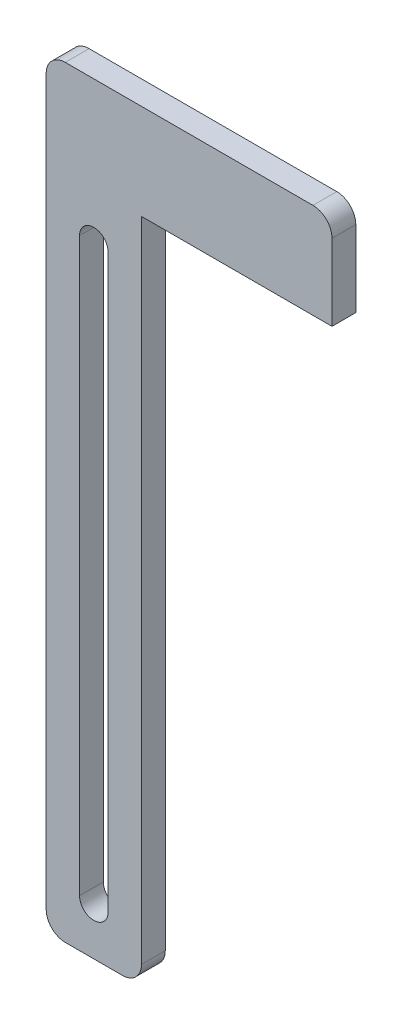
ISO-10303-21;
HEADER;
FILE_DESCRIPTION(('STEP AP214'),'2;1');
FILE_NAME('part.step','',(''),(''),'','','');
FILE_SCHEMA(('AUTOMOTIVE_DESIGN { 1 0 10303 214 1 1 1 1 }'));
ENDSEC;
DATA;
#1=APPLICATION_CONTEXT('core data for automotive mechanical design processes');
#2=APPLICATION_PROTOCOL_DEFINITION('international standard','automotive_design',2000,#1);
#3=PRODUCT_CONTEXT('',#1,'mechanical');
#4=PRODUCT('Part','Part','',(#3));
#5=PRODUCT_RELATED_PRODUCT_CATEGORY('part','',(#4));
#6=PRODUCT_DEFINITION_FORMATION('','',#4);
#7=PRODUCT_DEFINITION_CONTEXT('part definition',#1,'design');
#8=PRODUCT_DEFINITION('design','',#6,#7);
#9=PRODUCT_DEFINITION_SHAPE('','',#8);
#10=(LENGTH_UNIT() NAMED_UNIT(*) SI_UNIT(.MILLI.,.METRE.));
#11=(NAMED_UNIT(*) PLANE_ANGLE_UNIT() SI_UNIT($,.RADIAN.));
#12=(NAMED_UNIT(*) SI_UNIT($,.STERADIAN.) SOLID_ANGLE_UNIT());
#13=UNCERTAINTY_MEASURE_WITH_UNIT(LENGTH_MEASURE(1.E-05),#10,'distance_accuracy_value','');
#14=(GEOMETRIC_REPRESENTATION_CONTEXT(3) GLOBAL_UNCERTAINTY_ASSIGNED_CONTEXT((#13)) GLOBAL_UNIT_ASSIGNED_CONTEXT((#10,
#11,#12)) REPRESENTATION_CONTEXT('',''));
#15=CARTESIAN_POINT('',(0.,0.,0.));
#16=DIRECTION('',(0.,0.,1.));
#17=DIRECTION('',(1.,0.,0.));
#18=AXIS2_PLACEMENT_3D('',#15,#16,#17);
#19=CARTESIAN_POINT('',(0.,0.,3.175));
#20=DIRECTION('',(0.,0.,1.));
#21=DIRECTION('',(1.,0.,0.));
#22=AXIS2_PLACEMENT_3D('',#19,#20,#21);
#23=PLANE('',#22);
#24=DIRECTION('',(1.,0.,0.));
#25=VECTOR('',#24,1.);
#26=CARTESIAN_POINT('',(0.,0.,3.175));
#27=LINE('',#26,#25);
#28=CARTESIAN_POINT('',(2.54,0.,3.175));
#29=VERTEX_POINT('',#28);
#30=CARTESIAN_POINT('',(10.16,0.,3.175));
#31=VERTEX_POINT('',#30);
#32=EDGE_CURVE('E238',#29,#31,#27,.T.);
#33=ORIENTED_EDGE('',*,*,#32,.T.);
#34=CARTESIAN_POINT('',(10.16,2.54,3.175));
#35=DIRECTION('',(0.,0.,1.));
#36=DIRECTION('',(1.,0.,0.));
#37=AXIS2_PLACEMENT_3D('',#34,#35,#36);
#38=CIRCLE('',#37,2.54);
#39=CARTESIAN_POINT('',(12.7,2.54,3.175));
#40=VERTEX_POINT('',#39);
#41=EDGE_CURVE('E193',#31,#40,#38,.T.);
#42=ORIENTED_EDGE('',*,*,#41,.T.);
#43=DIRECTION('',(0.,1.,0.));
#44=VECTOR('',#43,1.);
#45=CARTESIAN_POINT('',(12.7,0.,3.175));
#46=LINE('',#45,#44);
#47=CARTESIAN_POINT('',(12.7,88.9,3.175));
#48=VERTEX_POINT('',#47);
#49=EDGE_CURVE('E184',#40,#48,#46,.T.);
#50=ORIENTED_EDGE('',*,*,#49,.T.);
#51=DIRECTION('',(1.,0.,0.));
#52=VECTOR('',#51,1.);
#53=CARTESIAN_POINT('',(0.,88.9,3.175));
#54=LINE('',#53,#52);
#55=CARTESIAN_POINT('',(38.1,88.9,3.175));
#56=VERTEX_POINT('',#55);
#57=EDGE_CURVE('E190',#48,#56,#54,.T.);
#58=ORIENTED_EDGE('',*,*,#57,.T.);
#59=DIRECTION('',(0.,-1.,0.));
#60=VECTOR('',#59,1.);
#61=CARTESIAN_POINT('',(38.1,0.,3.175));
#62=LINE('',#61,#60);
#63=CARTESIAN_POINT('',(38.1,99.06,3.175));
#64=VERTEX_POINT('',#63);
#65=EDGE_CURVE('E217',#64,#56,#62,.T.);
#66=ORIENTED_EDGE('',*,*,#65,.F.);
#67=CARTESIAN_POINT('',(35.56,99.06,3.175));
#68=DIRECTION('',(0.,0.,1.));
#69=DIRECTION('',(1.,0.,0.));
#70=AXIS2_PLACEMENT_3D('',#67,#68,#69);
#71=CIRCLE('',#70,2.54);
#72=CARTESIAN_POINT('',(35.56,101.6,3.175));
#73=VERTEX_POINT('',#72);
#74=EDGE_CURVE('E259',#64,#73,#71,.T.);
#75=ORIENTED_EDGE('',*,*,#74,.T.);
#76=DIRECTION('',(1.,0.,0.));
#77=VECTOR('',#76,1.);
#78=CARTESIAN_POINT('',(0.,101.6,3.175));
#79=LINE('',#78,#77);
#80=CARTESIAN_POINT('',(2.53999999999998,101.6,3.175));
#81=VERTEX_POINT('',#80);
#82=EDGE_CURVE('E213',#81,#73,#79,.T.);
#83=ORIENTED_EDGE('',*,*,#82,.F.);
#84=CARTESIAN_POINT('',(2.53999999999998,99.06,3.175));
#85=DIRECTION('',(0.,0.,1.));
#86=DIRECTION('',(1.,0.,0.));
#87=AXIS2_PLACEMENT_3D('',#84,#85,#86);
#88=CIRCLE('',#87,2.54);
#89=CARTESIAN_POINT('',(0.,99.06,3.175));
#90=VERTEX_POINT('',#89);
#91=EDGE_CURVE('E98',#81,#90,#88,.T.);
#92=ORIENTED_EDGE('',*,*,#91,.T.);
#93=DIRECTION('',(0.,1.,0.));
#94=VECTOR('',#93,1.);
#95=CARTESIAN_POINT('',(0.,0.,3.175));
#96=LINE('',#95,#94);
#97=CARTESIAN_POINT('',(0.,2.54,3.175));
#98=VERTEX_POINT('',#97);
#99=EDGE_CURVE('E197',#98,#90,#96,.T.);
#100=ORIENTED_EDGE('',*,*,#99,.F.);
#101=CARTESIAN_POINT('',(2.54,2.54,3.175));
#102=DIRECTION('',(0.,0.,1.));
#103=DIRECTION('',(1.,0.,0.));
#104=AXIS2_PLACEMENT_3D('',#101,#102,#103);
#105=CIRCLE('',#104,2.54);
#106=EDGE_CURVE('E265',#98,#29,#105,.T.);
#107=ORIENTED_EDGE('',*,*,#106,.T.);
#108=EDGE_LOOP('',(#33,#42,#50,#58,#66,#75,#83,#92,#100,#107));
#109=FACE_BOUND('',#108,.T.);
#110=DIRECTION('',(0.,-1.,0.));
#111=VECTOR('',#110,1.);
#112=CARTESIAN_POINT('',(4.445,0.,3.175));
#113=LINE('',#112,#111);
#114=CARTESIAN_POINT('',(4.44499999999999,82.55,3.175));
#115=VERTEX_POINT('',#114);
#116=CARTESIAN_POINT('',(4.445,6.35,3.175));
#117=VERTEX_POINT('',#116);
#118=EDGE_CURVE('E291',#115,#117,#113,.T.);
#119=ORIENTED_EDGE('',*,*,#118,.F.);
#120=CARTESIAN_POINT('',(6.34999999999999,82.55,3.175));
#121=DIRECTION('',(0.,0.,1.));
#122=DIRECTION('',(1.,0.,0.));
#123=AXIS2_PLACEMENT_3D('',#120,#121,#122);
#124=CIRCLE('',#123,1.905);
#125=CARTESIAN_POINT('',(8.25499999999999,82.55,3.175));
#126=VERTEX_POINT('',#125);
#127=EDGE_CURVE('E299',#126,#115,#124,.T.);
#128=ORIENTED_EDGE('',*,*,#127,.F.);
#129=DIRECTION('',(0.,-1.,0.));
#130=VECTOR('',#129,1.);
#131=CARTESIAN_POINT('',(8.255,0.,3.175));
#132=LINE('',#131,#130);
#133=CARTESIAN_POINT('',(8.255,6.35,3.175));
#134=VERTEX_POINT('',#133);
#135=EDGE_CURVE('E296',#126,#134,#132,.T.);
#136=ORIENTED_EDGE('',*,*,#135,.T.);
#137=CARTESIAN_POINT('',(6.35,6.35,3.175));
#138=DIRECTION('',(0.,0.,1.));
#139=DIRECTION('',(1.,0.,0.));
#140=AXIS2_PLACEMENT_3D('',#137,#138,#139);
#141=CIRCLE('',#140,1.905);
#142=EDGE_CURVE('E293',#117,#134,#141,.T.);
#143=ORIENTED_EDGE('',*,*,#142,.F.);
#144=EDGE_LOOP('',(#119,#128,#136,#143));
#145=FACE_BOUND('',#144,.T.);
#146=ADVANCED_FACE('F83',(#109,#145),#23,.T.);
#147=CARTESIAN_POINT('',(38.1,0.,3.175));
#148=DIRECTION('',(1.,0.,0.));
#149=DIRECTION('',(0.,1.,0.));
#150=AXIS2_PLACEMENT_3D('',#147,#148,#149);
#151=PLANE('',#150);
#152=DIRECTION('',(0.,-1.,0.));
#153=VECTOR('',#152,1.);
#154=CARTESIAN_POINT('',(38.1,0.,0.));
#155=LINE('',#154,#153);
#156=CARTESIAN_POINT('',(38.1,99.06,0.));
#157=VERTEX_POINT('',#156);
#158=CARTESIAN_POINT('',(38.1,88.9,0.));
#159=VERTEX_POINT('',#158);
#160=EDGE_CURVE('E239',#157,#159,#155,.T.);
#161=ORIENTED_EDGE('',*,*,#160,.F.);
#162=DIRECTION('',(0.,0.,-1.));
#163=VECTOR('',#162,1.);
#164=CARTESIAN_POINT('',(38.1,99.06,3.175));
#165=LINE('',#164,#163);
#166=EDGE_CURVE('E12',#157,#64,#165,.F.);
#167=ORIENTED_EDGE('',*,*,#166,.T.);
#168=ORIENTED_EDGE('',*,*,#65,.T.);
#169=DIRECTION('',(0.,0.,-1.));
#170=VECTOR('',#169,1.);
#171=CARTESIAN_POINT('',(38.1,88.9,3.175));
#172=LINE('',#171,#170);
#173=EDGE_CURVE('E209',#56,#159,#172,.T.);
#174=ORIENTED_EDGE('',*,*,#173,.T.);
#175=EDGE_LOOP('',(#161,#167,#168,#174));
#176=FACE_BOUND('',#175,.T.);
#177=ADVANCED_FACE('F344',(#176),#151,.T.);
#178=CARTESIAN_POINT('',(0.,0.,0.));
#179=DIRECTION('',(0.,0.,1.));
#180=DIRECTION('',(1.,0.,0.));
#181=AXIS2_PLACEMENT_3D('',#178,#179,#180);
#182=PLANE('',#181);
#183=DIRECTION('',(0.,1.,0.));
#184=VECTOR('',#183,1.);
#185=CARTESIAN_POINT('',(12.7,0.,0.));
#186=LINE('',#185,#184);
#187=CARTESIAN_POINT('',(12.7,2.54,0.));
#188=VERTEX_POINT('',#187);
#189=CARTESIAN_POINT('',(12.7,88.9,0.));
#190=VERTEX_POINT('',#189);
#191=EDGE_CURVE('E204',#188,#190,#186,.T.);
#192=ORIENTED_EDGE('',*,*,#191,.F.);
#193=CARTESIAN_POINT('',(10.16,2.54,0.));
#194=DIRECTION('',(0.,0.,1.));
#195=DIRECTION('',(1.,0.,0.));
#196=AXIS2_PLACEMENT_3D('',#193,#194,#195);
#197=CIRCLE('',#196,2.54);
#198=CARTESIAN_POINT('',(10.16,0.,0.));
#199=VERTEX_POINT('',#198);
#200=EDGE_CURVE('E257',#188,#199,#197,.F.);
#201=ORIENTED_EDGE('',*,*,#200,.T.);
#202=DIRECTION('',(1.,0.,0.));
#203=VECTOR('',#202,1.);
#204=CARTESIAN_POINT('',(0.,0.,0.));
#205=LINE('',#204,#203);
#206=CARTESIAN_POINT('',(2.54,0.,0.));
#207=VERTEX_POINT('',#206);
#208=EDGE_CURVE('E198',#207,#199,#205,.T.);
#209=ORIENTED_EDGE('',*,*,#208,.F.);
#210=CARTESIAN_POINT('',(2.54,2.54,0.));
#211=DIRECTION('',(0.,0.,1.));
#212=DIRECTION('',(1.,0.,0.));
#213=AXIS2_PLACEMENT_3D('',#210,#211,#212);
#214=CIRCLE('',#213,2.54);
#215=CARTESIAN_POINT('',(0.,2.54,0.));
#216=VERTEX_POINT('',#215);
#217=EDGE_CURVE('E378',#207,#216,#214,.F.);
#218=ORIENTED_EDGE('',*,*,#217,.T.);
#219=DIRECTION('',(0.,1.,0.));
#220=VECTOR('',#219,1.);
#221=CARTESIAN_POINT('',(0.,0.,0.));
#222=LINE('',#221,#220);
#223=CARTESIAN_POINT('',(0.,99.06,0.));
#224=VERTEX_POINT('',#223);
#225=EDGE_CURVE('E242',#216,#224,#222,.T.);
#226=ORIENTED_EDGE('',*,*,#225,.T.);
#227=CARTESIAN_POINT('',(2.53999999999998,99.06,0.));
#228=DIRECTION('',(0.,0.,1.));
#229=DIRECTION('',(1.,0.,0.));
#230=AXIS2_PLACEMENT_3D('',#227,#228,#229);
#231=CIRCLE('',#230,2.54);
#232=CARTESIAN_POINT('',(2.53999999999998,101.6,0.));
#233=VERTEX_POINT('',#232);
#234=EDGE_CURVE('E286',#224,#233,#231,.F.);
#235=ORIENTED_EDGE('',*,*,#234,.T.);
#236=DIRECTION('',(1.,0.,0.));
#237=VECTOR('',#236,1.);
#238=CARTESIAN_POINT('',(0.,101.6,0.));
#239=LINE('',#238,#237);
#240=CARTESIAN_POINT('',(35.56,101.6,0.));
#241=VERTEX_POINT('',#240);
#242=EDGE_CURVE('E226',#233,#241,#239,.T.);
#243=ORIENTED_EDGE('',*,*,#242,.T.);
#244=CARTESIAN_POINT('',(35.56,99.06,0.));
#245=DIRECTION('',(0.,0.,1.));
#246=DIRECTION('',(1.,0.,0.));
#247=AXIS2_PLACEMENT_3D('',#244,#245,#246);
#248=CIRCLE('',#247,2.54);
#249=EDGE_CURVE('E284',#241,#157,#248,.F.);
#250=ORIENTED_EDGE('',*,*,#249,.T.);
#251=ORIENTED_EDGE('',*,*,#160,.T.);
#252=DIRECTION('',(1.,0.,0.));
#253=VECTOR('',#252,1.);
#254=CARTESIAN_POINT('',(0.,88.9,0.));
#255=LINE('',#254,#253);
#256=EDGE_CURVE('E224',#190,#159,#255,.T.);
#257=ORIENTED_EDGE('',*,*,#256,.F.);
#258=EDGE_LOOP('',(#192,#201,#209,#218,#226,#235,#243,#250,#251,#257));
#259=FACE_BOUND('',#258,.T.);
#260=CARTESIAN_POINT('',(6.34999999999999,82.55,0.));
#261=DIRECTION('',(0.,0.,1.));
#262=DIRECTION('',(1.,0.,0.));
#263=AXIS2_PLACEMENT_3D('',#260,#261,#262);
#264=CIRCLE('',#263,1.905);
#265=CARTESIAN_POINT('',(8.25499999999999,82.55,0.));
#266=VERTEX_POINT('',#265);
#267=CARTESIAN_POINT('',(4.44499999999999,82.55,0.));
#268=VERTEX_POINT('',#267);
#269=EDGE_CURVE('E294',#266,#268,#264,.T.);
#270=ORIENTED_EDGE('',*,*,#269,.T.);
#271=DIRECTION('',(0.,-1.,0.));
#272=VECTOR('',#271,1.);
#273=CARTESIAN_POINT('',(4.445,0.,0.));
#274=LINE('',#273,#272);
#275=CARTESIAN_POINT('',(4.445,6.35,0.));
#276=VERTEX_POINT('',#275);
#277=EDGE_CURVE('E302',#268,#276,#274,.T.);
#278=ORIENTED_EDGE('',*,*,#277,.T.);
#279=CARTESIAN_POINT('',(6.35,6.35,0.));
#280=DIRECTION('',(0.,0.,1.));
#281=DIRECTION('',(1.,0.,0.));
#282=AXIS2_PLACEMENT_3D('',#279,#280,#281);
#283=CIRCLE('',#282,1.905);
#284=CARTESIAN_POINT('',(8.255,6.35,0.));
#285=VERTEX_POINT('',#284);
#286=EDGE_CURVE('E305',#276,#285,#283,.T.);
#287=ORIENTED_EDGE('',*,*,#286,.T.);
#288=DIRECTION('',(0.,-1.,0.));
#289=VECTOR('',#288,1.);
#290=CARTESIAN_POINT('',(8.255,0.,0.));
#291=LINE('',#290,#289);
#292=EDGE_CURVE('E308',#266,#285,#291,.T.);
#293=ORIENTED_EDGE('',*,*,#292,.F.);
#294=EDGE_LOOP('',(#270,#278,#287,#293));
#295=FACE_BOUND('',#294,.T.);
#296=ADVANCED_FACE('F282',(#259,#295),#182,.F.);
#297=CARTESIAN_POINT('',(0.,88.9,3.175));
#298=DIRECTION('',(0.,1.,0.));
#299=DIRECTION('',(0.,0.,1.));
#300=AXIS2_PLACEMENT_3D('',#297,#298,#299);
#301=PLANE('',#300);
#302=ORIENTED_EDGE('',*,*,#256,.T.);
#303=ORIENTED_EDGE('',*,*,#173,.F.);
#304=ORIENTED_EDGE('',*,*,#57,.F.);
#305=DIRECTION('',(0.,0.,-1.));
#306=VECTOR('',#305,1.);
#307=CARTESIAN_POINT('',(12.7,88.9,3.175));
#308=LINE('',#307,#306);
#309=EDGE_CURVE('E201',#48,#190,#308,.T.);
#310=ORIENTED_EDGE('',*,*,#309,.T.);
#311=EDGE_LOOP('',(#302,#303,#304,#310));
#312=FACE_BOUND('',#311,.T.);
#313=ADVANCED_FACE('F211',(#312),#301,.F.);
#314=CARTESIAN_POINT('',(0.,101.6,3.175));
#315=DIRECTION('',(0.,1.,0.));
#316=DIRECTION('',(0.,0.,1.));
#317=AXIS2_PLACEMENT_3D('',#314,#315,#316);
#318=PLANE('',#317);
#319=ORIENTED_EDGE('',*,*,#82,.T.);
#320=DIRECTION('',(0.,0.,-1.));
#321=VECTOR('',#320,1.);
#322=CARTESIAN_POINT('',(35.56,101.6,3.175));
#323=LINE('',#322,#321);
#324=EDGE_CURVE('E91',#73,#241,#323,.T.);
#325=ORIENTED_EDGE('',*,*,#324,.T.);
#326=ORIENTED_EDGE('',*,*,#242,.F.);
#327=DIRECTION('',(0.,0.,-1.));
#328=VECTOR('',#327,1.);
#329=CARTESIAN_POINT('',(2.53999999999998,101.6,3.175));
#330=LINE('',#329,#328);
#331=EDGE_CURVE('E272',#233,#81,#330,.F.);
#332=ORIENTED_EDGE('',*,*,#331,.T.);
#333=EDGE_LOOP('',(#319,#325,#326,#332));
#334=FACE_BOUND('',#333,.T.);
#335=ADVANCED_FACE('F278',(#334),#318,.T.);
#336=CARTESIAN_POINT('',(6.35,6.35,3.175));
#337=DIRECTION('',(0.,0.,-1.));
#338=DIRECTION('',(-1.,0.,0.));
#339=AXIS2_PLACEMENT_3D('',#336,#337,#338);
#340=CYLINDRICAL_SURFACE('',#339,1.905);
#341=ORIENTED_EDGE('',*,*,#286,.F.);
#342=DIRECTION('',(0.,0.,-1.));
#343=VECTOR('',#342,1.);
#344=CARTESIAN_POINT('',(4.445,6.35,3.175));
#345=LINE('',#344,#343);
#346=EDGE_CURVE('E235',#117,#276,#345,.T.);
#347=ORIENTED_EDGE('',*,*,#346,.F.);
#348=ORIENTED_EDGE('',*,*,#142,.T.);
#349=DIRECTION('',(0.,0.,-1.));
#350=VECTOR('',#349,1.);
#351=CARTESIAN_POINT('',(8.255,6.35,3.175));
#352=LINE('',#351,#350);
#353=EDGE_CURVE('E316',#134,#285,#352,.T.);
#354=ORIENTED_EDGE('',*,*,#353,.T.);
#355=EDGE_LOOP('',(#341,#347,#348,#354));
#356=FACE_BOUND('',#355,.T.);
#357=ADVANCED_FACE('F332',(#356),#340,.F.);
#358=CARTESIAN_POINT('',(8.255,0.,3.175));
#359=DIRECTION('',(1.,0.,0.));
#360=DIRECTION('',(0.,1.,0.));
#361=AXIS2_PLACEMENT_3D('',#358,#359,#360);
#362=PLANE('',#361);
#363=ORIENTED_EDGE('',*,*,#292,.T.);
#364=ORIENTED_EDGE('',*,*,#353,.F.);
#365=ORIENTED_EDGE('',*,*,#135,.F.);
#366=DIRECTION('',(0.,0.,-1.));
#367=VECTOR('',#366,1.);
#368=CARTESIAN_POINT('',(8.25499999999999,82.55,3.175));
#369=LINE('',#368,#367);
#370=EDGE_CURVE('E315',#126,#266,#369,.T.);
#371=ORIENTED_EDGE('',*,*,#370,.T.);
#372=EDGE_LOOP('',(#363,#364,#365,#371));
#373=FACE_BOUND('',#372,.T.);
#374=ADVANCED_FACE('F334',(#373),#362,.F.);
#375=CARTESIAN_POINT('',(6.34999999999999,82.55,3.175));
#376=DIRECTION('',(0.,0.,-1.));
#377=DIRECTION('',(-1.,0.,0.));
#378=AXIS2_PLACEMENT_3D('',#375,#376,#377);
#379=CYLINDRICAL_SURFACE('',#378,1.905);
#380=ORIENTED_EDGE('',*,*,#269,.F.);
#381=ORIENTED_EDGE('',*,*,#370,.F.);
#382=ORIENTED_EDGE('',*,*,#127,.T.);
#383=DIRECTION('',(0.,0.,-1.));
#384=VECTOR('',#383,1.);
#385=CARTESIAN_POINT('',(4.44499999999999,82.55,3.175));
#386=LINE('',#385,#384);
#387=EDGE_CURVE('E301',#115,#268,#386,.T.);
#388=ORIENTED_EDGE('',*,*,#387,.T.);
#389=EDGE_LOOP('',(#380,#381,#382,#388));
#390=FACE_BOUND('',#389,.T.);
#391=ADVANCED_FACE('F330',(#390),#379,.F.);
#392=CARTESIAN_POINT('',(4.445,0.,3.175));
#393=DIRECTION('',(1.,0.,0.));
#394=DIRECTION('',(0.,1.,0.));
#395=AXIS2_PLACEMENT_3D('',#392,#393,#394);
#396=PLANE('',#395);
#397=ORIENTED_EDGE('',*,*,#277,.F.);
#398=ORIENTED_EDGE('',*,*,#387,.F.);
#399=ORIENTED_EDGE('',*,*,#118,.T.);
#400=ORIENTED_EDGE('',*,*,#346,.T.);
#401=EDGE_LOOP('',(#397,#398,#399,#400));
#402=FACE_BOUND('',#401,.T.);
#403=ADVANCED_FACE('F322',(#402),#396,.T.);
#404=CARTESIAN_POINT('',(0.,0.,3.175));
#405=DIRECTION('',(-1.,0.,0.));
#406=DIRECTION('',(0.,-1.,0.));
#407=AXIS2_PLACEMENT_3D('',#404,#405,#406);
#408=PLANE('',#407);
#409=ORIENTED_EDGE('',*,*,#225,.F.);
#410=DIRECTION('',(0.,0.,-1.));
#411=VECTOR('',#410,1.);
#412=CARTESIAN_POINT('',(0.,2.54,3.175));
#413=LINE('',#412,#411);
#414=EDGE_CURVE('E105',#216,#98,#413,.F.);
#415=ORIENTED_EDGE('',*,*,#414,.T.);
#416=ORIENTED_EDGE('',*,*,#99,.T.);
#417=DIRECTION('',(0.,0.,-1.));
#418=VECTOR('',#417,1.);
#419=CARTESIAN_POINT('',(0.,99.06,3.175));
#420=LINE('',#419,#418);
#421=EDGE_CURVE('E268',#90,#224,#420,.T.);
#422=ORIENTED_EDGE('',*,*,#421,.T.);
#423=EDGE_LOOP('',(#409,#415,#416,#422));
#424=FACE_BOUND('',#423,.T.);
#425=ADVANCED_FACE('F361',(#424),#408,.T.);
#426=CARTESIAN_POINT('',(0.,0.,3.175));
#427=DIRECTION('',(0.,1.,0.));
#428=DIRECTION('',(0.,0.,1.));
#429=AXIS2_PLACEMENT_3D('',#426,#427,#428);
#430=PLANE('',#429);
#431=ORIENTED_EDGE('',*,*,#208,.T.);
#432=DIRECTION('',(0.,0.,-1.));
#433=VECTOR('',#432,1.);
#434=CARTESIAN_POINT('',(10.16,0.,3.175));
#435=LINE('',#434,#433);
#436=EDGE_CURVE('E251',#199,#31,#435,.F.);
#437=ORIENTED_EDGE('',*,*,#436,.T.);
#438=ORIENTED_EDGE('',*,*,#32,.F.);
#439=DIRECTION('',(0.,0.,-1.));
#440=VECTOR('',#439,1.);
#441=CARTESIAN_POINT('',(2.54,0.,0.));
#442=LINE('',#441,#440);
#443=EDGE_CURVE('E253',#29,#207,#442,.T.);
#444=ORIENTED_EDGE('',*,*,#443,.T.);
#445=EDGE_LOOP('',(#431,#437,#438,#444));
#446=FACE_BOUND('',#445,.T.);
#447=ADVANCED_FACE('F249',(#446),#430,.F.);
#448=CARTESIAN_POINT('',(12.7,0.,3.175));
#449=DIRECTION('',(-1.,0.,0.));
#450=DIRECTION('',(0.,-1.,0.));
#451=AXIS2_PLACEMENT_3D('',#448,#449,#450);
#452=PLANE('',#451);
#453=ORIENTED_EDGE('',*,*,#49,.F.);
#454=DIRECTION('',(0.,0.,-1.));
#455=VECTOR('',#454,1.);
#456=CARTESIAN_POINT('',(12.7,2.54,3.175));
#457=LINE('',#456,#455);
#458=EDGE_CURVE('E208',#40,#188,#457,.T.);
#459=ORIENTED_EDGE('',*,*,#458,.T.);
#460=ORIENTED_EDGE('',*,*,#191,.T.);
#461=ORIENTED_EDGE('',*,*,#309,.F.);
#462=EDGE_LOOP('',(#453,#459,#460,#461));
#463=FACE_BOUND('',#462,.T.);
#464=ADVANCED_FACE('F202',(#463),#452,.F.);
#465=CARTESIAN_POINT('',(10.16,2.54,3.175));
#466=DIRECTION('',(0.,0.,-1.));
#467=DIRECTION('',(-1.,0.,0.));
#468=AXIS2_PLACEMENT_3D('',#465,#466,#467);
#469=CYLINDRICAL_SURFACE('',#468,2.54);
#470=ORIENTED_EDGE('',*,*,#41,.F.);
#471=ORIENTED_EDGE('',*,*,#436,.F.);
#472=ORIENTED_EDGE('',*,*,#200,.F.);
#473=ORIENTED_EDGE('',*,*,#458,.F.);
#474=EDGE_LOOP('',(#470,#471,#472,#473));
#475=FACE_BOUND('',#474,.T.);
#476=ADVANCED_FACE('F256',(#475),#469,.T.);
#477=CARTESIAN_POINT('',(2.54,2.54,3.175));
#478=DIRECTION('',(0.,0.,1.));
#479=DIRECTION('',(1.,0.,0.));
#480=AXIS2_PLACEMENT_3D('',#477,#478,#479);
#481=CYLINDRICAL_SURFACE('',#480,2.54);
#482=ORIENTED_EDGE('',*,*,#106,.F.);
#483=ORIENTED_EDGE('',*,*,#414,.F.);
#484=ORIENTED_EDGE('',*,*,#217,.F.);
#485=ORIENTED_EDGE('',*,*,#443,.F.);
#486=EDGE_LOOP('',(#482,#483,#484,#485));
#487=FACE_BOUND('',#486,.T.);
#488=ADVANCED_FACE('F366',(#487),#481,.T.);
#489=CARTESIAN_POINT('',(35.56,99.06,3.175));
#490=DIRECTION('',(0.,0.,-1.));
#491=DIRECTION('',(-1.,0.,0.));
#492=AXIS2_PLACEMENT_3D('',#489,#490,#491);
#493=CYLINDRICAL_SURFACE('',#492,2.54);
#494=ORIENTED_EDGE('',*,*,#74,.F.);
#495=ORIENTED_EDGE('',*,*,#166,.F.);
#496=ORIENTED_EDGE('',*,*,#249,.F.);
#497=ORIENTED_EDGE('',*,*,#324,.F.);
#498=EDGE_LOOP('',(#494,#495,#496,#497));
#499=FACE_BOUND('',#498,.T.);
#500=ADVANCED_FACE('F385',(#499),#493,.T.);
#501=CARTESIAN_POINT('',(2.53999999999998,99.06,3.175));
#502=DIRECTION('',(0.,0.,-1.));
#503=DIRECTION('',(-1.,0.,0.));
#504=AXIS2_PLACEMENT_3D('',#501,#502,#503);
#505=CYLINDRICAL_SURFACE('',#504,2.54);
#506=ORIENTED_EDGE('',*,*,#91,.F.);
#507=ORIENTED_EDGE('',*,*,#331,.F.);
#508=ORIENTED_EDGE('',*,*,#234,.F.);
#509=ORIENTED_EDGE('',*,*,#421,.F.);
#510=EDGE_LOOP('',(#506,#507,#508,#509));
#511=FACE_BOUND('',#510,.T.);
#512=ADVANCED_FACE('F85',(#511),#505,.T.);
#513=CLOSED_SHELL('',(#146,#177,#296,#313,#335,#357,#374,#391,#403,#425,#447,#464,#476,#488,
#500,#512));
#514=MANIFOLD_SOLID_BREP('B2',#513);
#515=ADVANCED_BREP_SHAPE_REPRESENTATION('',(#18,#514),#14);
#516=SHAPE_DEFINITION_REPRESENTATION(#9,#515);
ENDSEC;
END-ISO-10303-21;
